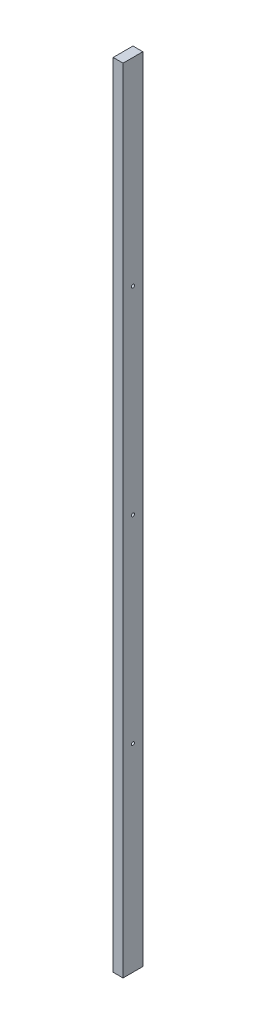
ISO-10303-21;
HEADER;
FILE_DESCRIPTION(('STEP AP214'),'2;1');
FILE_NAME('part.step','',(''),(''),'','','');
FILE_SCHEMA(('AUTOMOTIVE_DESIGN { 1 0 10303 214 1 1 1 1 }'));
ENDSEC;
DATA;
#1=APPLICATION_CONTEXT('core data for automotive mechanical design processes');
#2=APPLICATION_PROTOCOL_DEFINITION('international standard','automotive_design',2000,#1);
#3=PRODUCT_CONTEXT('',#1,'mechanical');
#4=PRODUCT('Part','Part','',(#3));
#5=PRODUCT_RELATED_PRODUCT_CATEGORY('part','',(#4));
#6=PRODUCT_DEFINITION_FORMATION('','',#4);
#7=PRODUCT_DEFINITION_CONTEXT('part definition',#1,'design');
#8=PRODUCT_DEFINITION('design','',#6,#7);
#9=PRODUCT_DEFINITION_SHAPE('','',#8);
#10=(LENGTH_UNIT() NAMED_UNIT(*) SI_UNIT(.MILLI.,.METRE.));
#11=(NAMED_UNIT(*) PLANE_ANGLE_UNIT() SI_UNIT($,.RADIAN.));
#12=(NAMED_UNIT(*) SI_UNIT($,.STERADIAN.) SOLID_ANGLE_UNIT());
#13=UNCERTAINTY_MEASURE_WITH_UNIT(LENGTH_MEASURE(1.E-05),#10,'distance_accuracy_value','');
#14=(GEOMETRIC_REPRESENTATION_CONTEXT(3) GLOBAL_UNCERTAINTY_ASSIGNED_CONTEXT((#13)) GLOBAL_UNIT_ASSIGNED_CONTEXT((#10,
#11,#12)) REPRESENTATION_CONTEXT('',''));
#15=CARTESIAN_POINT('',(0.,0.,0.));
#16=DIRECTION('',(0.,0.,1.));
#17=DIRECTION('',(1.,0.,0.));
#18=AXIS2_PLACEMENT_3D('',#15,#16,#17);
#19=CARTESIAN_POINT('',(-12.5,2000.,-25.));
#20=DIRECTION('',(1.,0.,0.));
#21=DIRECTION('',(0.,0.,-1.));
#22=AXIS2_PLACEMENT_3D('',#19,#20,#21);
#23=PLANE('',#22);
#24=CARTESIAN_POINT('',(-12.5,1000.,0.));
#25=DIRECTION('',(1.,0.,0.));
#26=DIRECTION('',(0.,0.,-1.));
#27=AXIS2_PLACEMENT_3D('',#24,#25,#26);
#28=CIRCLE('',#27,4.);
#29=CARTESIAN_POINT('',(-12.5,1000.,-4.00000000000001));
#30=VERTEX_POINT('',#29);
#31=EDGE_CURVE('E143',#30,#30,#28,.T.);
#32=ORIENTED_EDGE('',*,*,#31,.T.);
#33=EDGE_LOOP('',(#32));
#34=FACE_BOUND('',#33,.T.);
#35=CARTESIAN_POINT('',(-12.5000000000002,1500.,0.));
#36=DIRECTION('',(1.,0.,0.));
#37=DIRECTION('',(0.,0.,-1.));
#38=AXIS2_PLACEMENT_3D('',#35,#36,#37);
#39=CIRCLE('',#38,4.);
#40=CARTESIAN_POINT('',(-12.5000000000002,1500.,-4.00000000000001));
#41=VERTEX_POINT('',#40);
#42=EDGE_CURVE('E114',#41,#41,#39,.T.);
#43=ORIENTED_EDGE('',*,*,#42,.T.);
#44=EDGE_LOOP('',(#43));
#45=FACE_BOUND('',#44,.T.);
#46=CARTESIAN_POINT('',(-12.5000000000002,500.,0.));
#47=DIRECTION('',(1.,0.,0.));
#48=DIRECTION('',(0.,0.,-1.));
#49=AXIS2_PLACEMENT_3D('',#46,#47,#48);
#50=CIRCLE('',#49,4.);
#51=CARTESIAN_POINT('',(-12.5000000000002,500.,-4.00000000000001));
#52=VERTEX_POINT('',#51);
#53=EDGE_CURVE('E134',#52,#52,#50,.T.);
#54=ORIENTED_EDGE('',*,*,#53,.T.);
#55=EDGE_LOOP('',(#54));
#56=FACE_BOUND('',#55,.T.);
#57=DIRECTION('',(0.,0.,1.));
#58=VECTOR('',#57,1.);
#59=CARTESIAN_POINT('',(-12.5,0.,-25.));
#60=LINE('',#59,#58);
#61=CARTESIAN_POINT('',(-12.5,0.,-25.));
#62=VERTEX_POINT('',#61);
#63=CARTESIAN_POINT('',(-12.5,0.,25.));
#64=VERTEX_POINT('',#63);
#65=EDGE_CURVE('E110',#62,#64,#60,.T.);
#66=ORIENTED_EDGE('',*,*,#65,.T.);
#67=DIRECTION('',(0.,-1.,0.));
#68=VECTOR('',#67,1.);
#69=CARTESIAN_POINT('',(-12.5,2000.,25.));
#70=LINE('',#69,#68);
#71=CARTESIAN_POINT('',(-12.5,2000.,25.));
#72=VERTEX_POINT('',#71);
#73=EDGE_CURVE('E11',#72,#64,#70,.T.);
#74=ORIENTED_EDGE('',*,*,#73,.F.);
#75=DIRECTION('',(0.,0.,1.));
#76=VECTOR('',#75,1.);
#77=CARTESIAN_POINT('',(-12.5,2000.,-25.));
#78=LINE('',#77,#76);
#79=CARTESIAN_POINT('',(-12.5,2000.,-25.));
#80=VERTEX_POINT('',#79);
#81=EDGE_CURVE('E94',#80,#72,#78,.T.);
#82=ORIENTED_EDGE('',*,*,#81,.F.);
#83=DIRECTION('',(0.,-1.,0.));
#84=VECTOR('',#83,1.);
#85=CARTESIAN_POINT('',(-12.5,2000.,-25.));
#86=LINE('',#85,#84);
#87=EDGE_CURVE('E106',#80,#62,#86,.T.);
#88=ORIENTED_EDGE('',*,*,#87,.T.);
#89=EDGE_LOOP('',(#66,#74,#82,#88));
#90=FACE_BOUND('',#89,.T.);
#91=ADVANCED_FACE('F42',(#34,#45,#56,#90),#23,.F.);
#92=CARTESIAN_POINT('',(12.5,2000.,25.));
#93=DIRECTION('',(0.,0.,-1.));
#94=DIRECTION('',(-1.,0.,0.));
#95=AXIS2_PLACEMENT_3D('',#92,#93,#94);
#96=PLANE('',#95);
#97=DIRECTION('',(1.,0.,0.));
#98=VECTOR('',#97,1.);
#99=CARTESIAN_POINT('',(12.5,0.,25.));
#100=LINE('',#99,#98);
#101=CARTESIAN_POINT('',(12.5,0.,25.));
#102=VERTEX_POINT('',#101);
#103=EDGE_CURVE('E99',#64,#102,#100,.T.);
#104=ORIENTED_EDGE('',*,*,#103,.T.);
#105=DIRECTION('',(0.,-1.,0.));
#106=VECTOR('',#105,1.);
#107=CARTESIAN_POINT('',(12.5,2000.,25.));
#108=LINE('',#107,#106);
#109=CARTESIAN_POINT('',(12.5,2000.,25.));
#110=VERTEX_POINT('',#109);
#111=EDGE_CURVE('E51',#110,#102,#108,.T.);
#112=ORIENTED_EDGE('',*,*,#111,.F.);
#113=DIRECTION('',(1.,0.,0.));
#114=VECTOR('',#113,1.);
#115=CARTESIAN_POINT('',(12.5,2000.,25.));
#116=LINE('',#115,#114);
#117=EDGE_CURVE('E89',#72,#110,#116,.T.);
#118=ORIENTED_EDGE('',*,*,#117,.F.);
#119=ORIENTED_EDGE('',*,*,#73,.T.);
#120=EDGE_LOOP('',(#104,#112,#118,#119));
#121=FACE_BOUND('',#120,.T.);
#122=ADVANCED_FACE('F98',(#121),#96,.F.);
#123=CARTESIAN_POINT('',(12.5,2000.,-25.));
#124=DIRECTION('',(-1.,0.,0.));
#125=DIRECTION('',(0.,0.,1.));
#126=AXIS2_PLACEMENT_3D('',#123,#124,#125);
#127=PLANE('',#126);
#128=CARTESIAN_POINT('',(12.5,1000.,0.));
#129=DIRECTION('',(1.,0.,0.));
#130=DIRECTION('',(0.,0.,-1.));
#131=AXIS2_PLACEMENT_3D('',#128,#129,#130);
#132=CIRCLE('',#131,4.);
#133=CARTESIAN_POINT('',(12.5,1000.,-4.00000000000001));
#134=VERTEX_POINT('',#133);
#135=EDGE_CURVE('E150',#134,#134,#132,.T.);
#136=ORIENTED_EDGE('',*,*,#135,.F.);
#137=EDGE_LOOP('',(#136));
#138=FACE_BOUND('',#137,.T.);
#139=CARTESIAN_POINT('',(12.5,1500.,0.));
#140=DIRECTION('',(1.,0.,0.));
#141=DIRECTION('',(0.,0.,-1.));
#142=AXIS2_PLACEMENT_3D('',#139,#140,#141);
#143=CIRCLE('',#142,4.);
#144=CARTESIAN_POINT('',(12.5,1500.,-4.00000000000001));
#145=VERTEX_POINT('',#144);
#146=EDGE_CURVE('E138',#145,#145,#143,.T.);
#147=ORIENTED_EDGE('',*,*,#146,.F.);
#148=EDGE_LOOP('',(#147));
#149=FACE_BOUND('',#148,.T.);
#150=CARTESIAN_POINT('',(12.5,500.,0.));
#151=DIRECTION('',(1.,0.,0.));
#152=DIRECTION('',(0.,0.,-1.));
#153=AXIS2_PLACEMENT_3D('',#150,#151,#152);
#154=CIRCLE('',#153,4.);
#155=CARTESIAN_POINT('',(12.5,500.,-4.00000000000001));
#156=VERTEX_POINT('',#155);
#157=EDGE_CURVE('E139',#156,#156,#154,.T.);
#158=ORIENTED_EDGE('',*,*,#157,.F.);
#159=EDGE_LOOP('',(#158));
#160=FACE_BOUND('',#159,.T.);
#161=DIRECTION('',(0.,0.,-1.));
#162=VECTOR('',#161,1.);
#163=CARTESIAN_POINT('',(12.5,0.,-25.));
#164=LINE('',#163,#162);
#165=CARTESIAN_POINT('',(12.5,0.,-25.));
#166=VERTEX_POINT('',#165);
#167=EDGE_CURVE('E76',#102,#166,#164,.T.);
#168=ORIENTED_EDGE('',*,*,#167,.T.);
#169=DIRECTION('',(0.,-1.,0.));
#170=VECTOR('',#169,1.);
#171=CARTESIAN_POINT('',(12.5,2000.,-25.));
#172=LINE('',#171,#170);
#173=CARTESIAN_POINT('',(12.5,2000.,-25.));
#174=VERTEX_POINT('',#173);
#175=EDGE_CURVE('E101',#174,#166,#172,.T.);
#176=ORIENTED_EDGE('',*,*,#175,.F.);
#177=DIRECTION('',(0.,0.,-1.));
#178=VECTOR('',#177,1.);
#179=CARTESIAN_POINT('',(12.5,2000.,-25.));
#180=LINE('',#179,#178);
#181=EDGE_CURVE('E92',#110,#174,#180,.T.);
#182=ORIENTED_EDGE('',*,*,#181,.F.);
#183=ORIENTED_EDGE('',*,*,#111,.T.);
#184=EDGE_LOOP('',(#168,#176,#182,#183));
#185=FACE_BOUND('',#184,.T.);
#186=ADVANCED_FACE('F102',(#138,#149,#160,#185),#127,.F.);
#187=CARTESIAN_POINT('',(12.5,2000.,-25.));
#188=DIRECTION('',(0.,0.,1.));
#189=DIRECTION('',(1.,0.,0.));
#190=AXIS2_PLACEMENT_3D('',#187,#188,#189);
#191=PLANE('',#190);
#192=DIRECTION('',(-1.,0.,0.));
#193=VECTOR('',#192,1.);
#194=CARTESIAN_POINT('',(12.5,0.,-25.));
#195=LINE('',#194,#193);
#196=EDGE_CURVE('E82',#166,#62,#195,.T.);
#197=ORIENTED_EDGE('',*,*,#196,.T.);
#198=ORIENTED_EDGE('',*,*,#87,.F.);
#199=DIRECTION('',(-1.,0.,0.));
#200=VECTOR('',#199,1.);
#201=CARTESIAN_POINT('',(12.5,2000.,-25.));
#202=LINE('',#201,#200);
#203=EDGE_CURVE('E59',#174,#80,#202,.T.);
#204=ORIENTED_EDGE('',*,*,#203,.F.);
#205=ORIENTED_EDGE('',*,*,#175,.T.);
#206=EDGE_LOOP('',(#197,#198,#204,#205));
#207=FACE_BOUND('',#206,.T.);
#208=ADVANCED_FACE('F124',(#207),#191,.F.);
#209=CARTESIAN_POINT('',(0.,2000.,0.));
#210=DIRECTION('',(0.,-1.,0.));
#211=DIRECTION('',(0.,0.,-1.));
#212=AXIS2_PLACEMENT_3D('',#209,#210,#211);
#213=PLANE('',#212);
#214=ORIENTED_EDGE('',*,*,#81,.T.);
#215=ORIENTED_EDGE('',*,*,#117,.T.);
#216=ORIENTED_EDGE('',*,*,#181,.T.);
#217=ORIENTED_EDGE('',*,*,#203,.T.);
#218=EDGE_LOOP('',(#214,#215,#216,#217));
#219=FACE_BOUND('',#218,.T.);
#220=ADVANCED_FACE('F90',(#219),#213,.F.);
#221=CARTESIAN_POINT('',(0.,0.,0.));
#222=DIRECTION('',(0.,-1.,0.));
#223=DIRECTION('',(0.,0.,-1.));
#224=AXIS2_PLACEMENT_3D('',#221,#222,#223);
#225=PLANE('',#224);
#226=ORIENTED_EDGE('',*,*,#65,.F.);
#227=ORIENTED_EDGE('',*,*,#196,.F.);
#228=ORIENTED_EDGE('',*,*,#167,.F.);
#229=ORIENTED_EDGE('',*,*,#103,.F.);
#230=EDGE_LOOP('',(#226,#227,#228,#229));
#231=FACE_BOUND('',#230,.T.);
#232=ADVANCED_FACE('F127',(#231),#225,.T.);
#233=CARTESIAN_POINT('',(-2201.65898255,500.,0.));
#234=DIRECTION('',(1.,0.,0.));
#235=DIRECTION('',(0.,0.,-1.));
#236=AXIS2_PLACEMENT_3D('',#233,#234,#235);
#237=CYLINDRICAL_SURFACE('',#236,4.);
#238=ORIENTED_EDGE('',*,*,#157,.T.);
#239=EDGE_LOOP('',(#238));
#240=FACE_BOUND('',#239,.T.);
#241=ORIENTED_EDGE('',*,*,#53,.F.);
#242=EDGE_LOOP('',(#241));
#243=FACE_BOUND('',#242,.T.);
#244=ADVANCED_FACE('F165',(#240,#243),#237,.F.);
#245=CARTESIAN_POINT('',(-2201.65898255,1500.,0.));
#246=DIRECTION('',(1.,0.,0.));
#247=DIRECTION('',(0.,0.,-1.));
#248=AXIS2_PLACEMENT_3D('',#245,#246,#247);
#249=CYLINDRICAL_SURFACE('',#248,4.);
#250=ORIENTED_EDGE('',*,*,#146,.T.);
#251=EDGE_LOOP('',(#250));
#252=FACE_BOUND('',#251,.T.);
#253=ORIENTED_EDGE('',*,*,#42,.F.);
#254=EDGE_LOOP('',(#253));
#255=FACE_BOUND('',#254,.T.);
#256=ADVANCED_FACE('F168',(#252,#255),#249,.F.);
#257=CARTESIAN_POINT('',(-37.5,1000.,0.));
#258=DIRECTION('',(1.,0.,0.));
#259=DIRECTION('',(0.,0.,-1.));
#260=AXIS2_PLACEMENT_3D('',#257,#258,#259);
#261=CYLINDRICAL_SURFACE('',#260,4.);
#262=ORIENTED_EDGE('',*,*,#135,.T.);
#263=EDGE_LOOP('',(#262));
#264=FACE_BOUND('',#263,.T.);
#265=ORIENTED_EDGE('',*,*,#31,.F.);
#266=EDGE_LOOP('',(#265));
#267=FACE_BOUND('',#266,.T.);
#268=ADVANCED_FACE('F155',(#264,#267),#261,.F.);
#269=CLOSED_SHELL('',(#91,#122,#186,#208,#220,#232,#244,#256,#268));
#270=MANIFOLD_SOLID_BREP('B2',#269);
#271=ADVANCED_BREP_SHAPE_REPRESENTATION('',(#18,#270),#14);
#272=SHAPE_DEFINITION_REPRESENTATION(#9,#271);
ENDSEC;
END-ISO-10303-21;
